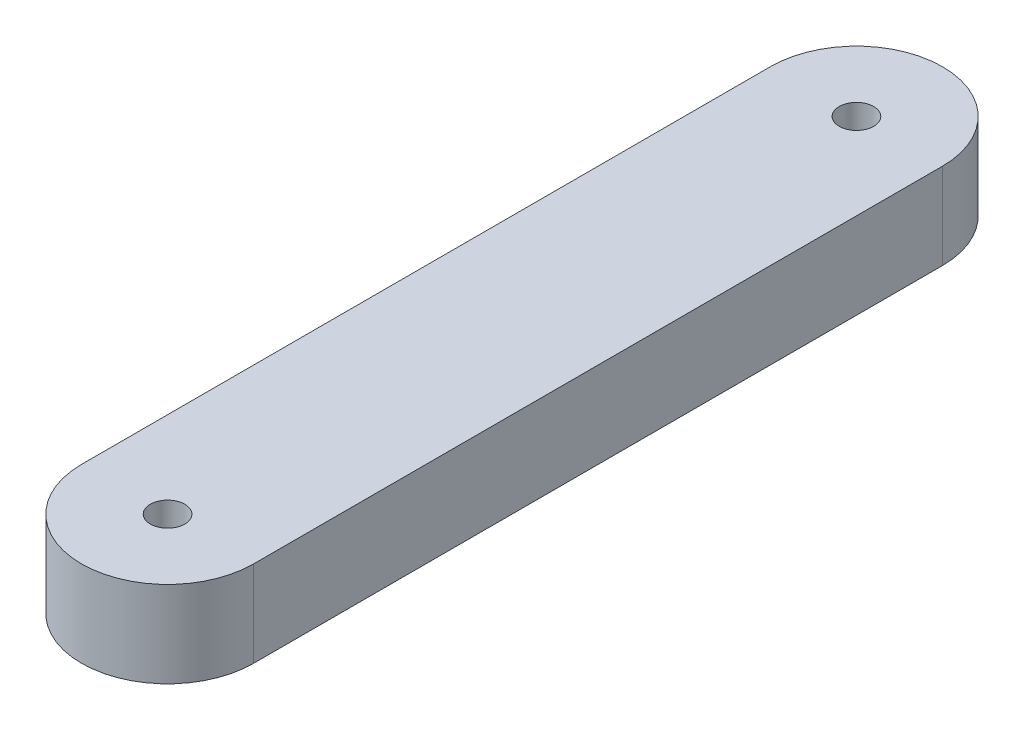
ISO-10303-21;
HEADER;
FILE_DESCRIPTION(('STEP AP214'),'2;1');
FILE_NAME('part.step','',(''),(''),'','','');
FILE_SCHEMA(('AUTOMOTIVE_DESIGN { 1 0 10303 214 1 1 1 1 }'));
ENDSEC;
DATA;
#1=APPLICATION_CONTEXT('core data for automotive mechanical design processes');
#2=APPLICATION_PROTOCOL_DEFINITION('international standard','automotive_design',2000,#1);
#3=PRODUCT_CONTEXT('',#1,'mechanical');
#4=PRODUCT('Part','Part','',(#3));
#5=PRODUCT_RELATED_PRODUCT_CATEGORY('part','',(#4));
#6=PRODUCT_DEFINITION_FORMATION('','',#4);
#7=PRODUCT_DEFINITION_CONTEXT('part definition',#1,'design');
#8=PRODUCT_DEFINITION('design','',#6,#7);
#9=PRODUCT_DEFINITION_SHAPE('','',#8);
#10=(LENGTH_UNIT() NAMED_UNIT(*) SI_UNIT(.MILLI.,.METRE.));
#11=(NAMED_UNIT(*) PLANE_ANGLE_UNIT() SI_UNIT($,.RADIAN.));
#12=(NAMED_UNIT(*) SI_UNIT($,.STERADIAN.) SOLID_ANGLE_UNIT());
#13=UNCERTAINTY_MEASURE_WITH_UNIT(LENGTH_MEASURE(1.E-05),#10,'distance_accuracy_value','');
#14=(GEOMETRIC_REPRESENTATION_CONTEXT(3) GLOBAL_UNCERTAINTY_ASSIGNED_CONTEXT((#13)) GLOBAL_UNIT_ASSIGNED_CONTEXT((#10,
#11,#12)) REPRESENTATION_CONTEXT('',''));
#15=CARTESIAN_POINT('',(0.,0.,0.));
#16=DIRECTION('',(0.,0.,1.));
#17=DIRECTION('',(1.,0.,0.));
#18=AXIS2_PLACEMENT_3D('',#15,#16,#17);
#19=CARTESIAN_POINT('',(0.,5.,-40.));
#20=DIRECTION('',(0.,1.,0.));
#21=DIRECTION('',(0.,0.,1.));
#22=AXIS2_PLACEMENT_3D('',#19,#20,#21);
#23=PLANE('',#22);
#24=CARTESIAN_POINT('',(0.,5.,0.));
#25=DIRECTION('',(0.,1.,0.));
#26=DIRECTION('',(0.,0.,1.));
#27=AXIS2_PLACEMENT_3D('',#24,#25,#26);
#28=CIRCLE('',#27,1.);
#29=CARTESIAN_POINT('',(0.,5.,1.));
#30=VERTEX_POINT('',#29);
#31=EDGE_CURVE('E112',#30,#30,#28,.T.);
#32=ORIENTED_EDGE('',*,*,#31,.F.);
#33=EDGE_LOOP('',(#32));
#34=FACE_BOUND('',#33,.T.);
#35=CARTESIAN_POINT('',(0.,5.,-40.));
#36=DIRECTION('',(0.,1.,0.));
#37=DIRECTION('',(0.,0.,1.));
#38=AXIS2_PLACEMENT_3D('',#35,#36,#37);
#39=CIRCLE('',#38,5.);
#40=CARTESIAN_POINT('',(5.,5.,-40.));
#41=VERTEX_POINT('',#40);
#42=CARTESIAN_POINT('',(-5.,5.,-40.));
#43=VERTEX_POINT('',#42);
#44=EDGE_CURVE('E92',#41,#43,#39,.T.);
#45=ORIENTED_EDGE('',*,*,#44,.T.);
#46=DIRECTION('',(0.,0.,1.));
#47=VECTOR('',#46,1.);
#48=CARTESIAN_POINT('',(-5.,5.,-40.));
#49=LINE('',#48,#47);
#50=CARTESIAN_POINT('',(-5.,5.,0.));
#51=VERTEX_POINT('',#50);
#52=EDGE_CURVE('E87',#43,#51,#49,.T.);
#53=ORIENTED_EDGE('',*,*,#52,.T.);
#54=CARTESIAN_POINT('',(0.,5.,0.));
#55=DIRECTION('',(0.,1.,0.));
#56=DIRECTION('',(0.,0.,1.));
#57=AXIS2_PLACEMENT_3D('',#54,#55,#56);
#58=CIRCLE('',#57,5.);
#59=CARTESIAN_POINT('',(5.,5.,0.));
#60=VERTEX_POINT('',#59);
#61=EDGE_CURVE('E90',#51,#60,#58,.T.);
#62=ORIENTED_EDGE('',*,*,#61,.T.);
#63=DIRECTION('',(0.,0.,-1.));
#64=VECTOR('',#63,1.);
#65=CARTESIAN_POINT('',(5.,5.,-40.));
#66=LINE('',#65,#64);
#67=EDGE_CURVE('E57',#60,#41,#66,.T.);
#68=ORIENTED_EDGE('',*,*,#67,.T.);
#69=EDGE_LOOP('',(#45,#53,#62,#68));
#70=FACE_BOUND('',#69,.T.);
#71=CARTESIAN_POINT('',(0.,5.,-40.));
#72=DIRECTION('',(0.,1.,0.));
#73=DIRECTION('',(0.,0.,1.));
#74=AXIS2_PLACEMENT_3D('',#71,#72,#73);
#75=CIRCLE('',#74,1.);
#76=CARTESIAN_POINT('',(0.,5.,-39.));
#77=VERTEX_POINT('',#76);
#78=EDGE_CURVE('E134',#77,#77,#75,.T.);
#79=ORIENTED_EDGE('',*,*,#78,.F.);
#80=EDGE_LOOP('',(#79));
#81=FACE_BOUND('',#80,.T.);
#82=ADVANCED_FACE('F39',(#34,#70,#81),#23,.T.);
#83=CARTESIAN_POINT('',(0.,0.,-40.));
#84=DIRECTION('',(0.,1.,0.));
#85=DIRECTION('',(0.,0.,1.));
#86=AXIS2_PLACEMENT_3D('',#83,#84,#85);
#87=PLANE('',#86);
#88=CARTESIAN_POINT('',(0.,0.,-40.));
#89=DIRECTION('',(0.,1.,0.));
#90=DIRECTION('',(0.,0.,1.));
#91=AXIS2_PLACEMENT_3D('',#88,#89,#90);
#92=CIRCLE('',#91,5.);
#93=CARTESIAN_POINT('',(5.,0.,-40.));
#94=VERTEX_POINT('',#93);
#95=CARTESIAN_POINT('',(-5.,0.,-40.));
#96=VERTEX_POINT('',#95);
#97=EDGE_CURVE('E108',#94,#96,#92,.T.);
#98=ORIENTED_EDGE('',*,*,#97,.F.);
#99=DIRECTION('',(0.,0.,-1.));
#100=VECTOR('',#99,1.);
#101=CARTESIAN_POINT('',(5.,0.,-40.));
#102=LINE('',#101,#100);
#103=CARTESIAN_POINT('',(5.,0.,0.));
#104=VERTEX_POINT('',#103);
#105=EDGE_CURVE('E80',#104,#94,#102,.T.);
#106=ORIENTED_EDGE('',*,*,#105,.F.);
#107=CARTESIAN_POINT('',(0.,0.,0.));
#108=DIRECTION('',(0.,1.,0.));
#109=DIRECTION('',(0.,0.,1.));
#110=AXIS2_PLACEMENT_3D('',#107,#108,#109);
#111=CIRCLE('',#110,5.);
#112=CARTESIAN_POINT('',(-5.,0.,0.));
#113=VERTEX_POINT('',#112);
#114=EDGE_CURVE('E74',#113,#104,#111,.T.);
#115=ORIENTED_EDGE('',*,*,#114,.F.);
#116=DIRECTION('',(0.,0.,1.));
#117=VECTOR('',#116,1.);
#118=CARTESIAN_POINT('',(-5.,0.,-40.));
#119=LINE('',#118,#117);
#120=EDGE_CURVE('E97',#96,#113,#119,.T.);
#121=ORIENTED_EDGE('',*,*,#120,.F.);
#122=EDGE_LOOP('',(#98,#106,#115,#121));
#123=FACE_BOUND('',#122,.T.);
#124=CARTESIAN_POINT('',(0.,0.,0.));
#125=DIRECTION('',(0.,1.,0.));
#126=DIRECTION('',(0.,0.,1.));
#127=AXIS2_PLACEMENT_3D('',#124,#125,#126);
#128=CIRCLE('',#127,1.);
#129=CARTESIAN_POINT('',(0.,0.,1.));
#130=VERTEX_POINT('',#129);
#131=EDGE_CURVE('E130',#130,#130,#128,.T.);
#132=ORIENTED_EDGE('',*,*,#131,.T.);
#133=EDGE_LOOP('',(#132));
#134=FACE_BOUND('',#133,.T.);
#135=CARTESIAN_POINT('',(0.,0.,-40.));
#136=DIRECTION('',(0.,1.,0.));
#137=DIRECTION('',(0.,0.,1.));
#138=AXIS2_PLACEMENT_3D('',#135,#136,#137);
#139=CIRCLE('',#138,1.);
#140=CARTESIAN_POINT('',(0.,0.,-39.));
#141=VERTEX_POINT('',#140);
#142=EDGE_CURVE('E138',#141,#141,#139,.T.);
#143=ORIENTED_EDGE('',*,*,#142,.T.);
#144=EDGE_LOOP('',(#143));
#145=FACE_BOUND('',#144,.T.);
#146=ADVANCED_FACE('F125',(#123,#134,#145),#87,.F.);
#147=CARTESIAN_POINT('',(0.,5.,-40.));
#148=DIRECTION('',(0.,-1.,0.));
#149=DIRECTION('',(0.,0.,-1.));
#150=AXIS2_PLACEMENT_3D('',#147,#148,#149);
#151=CYLINDRICAL_SURFACE('',#150,5.);
#152=ORIENTED_EDGE('',*,*,#97,.T.);
#153=DIRECTION('',(0.,-1.,0.));
#154=VECTOR('',#153,1.);
#155=CARTESIAN_POINT('',(-5.,5.,-40.));
#156=LINE('',#155,#154);
#157=EDGE_CURVE('E11',#43,#96,#156,.T.);
#158=ORIENTED_EDGE('',*,*,#157,.F.);
#159=ORIENTED_EDGE('',*,*,#44,.F.);
#160=DIRECTION('',(0.,-1.,0.));
#161=VECTOR('',#160,1.);
#162=CARTESIAN_POINT('',(5.,5.,-40.));
#163=LINE('',#162,#161);
#164=EDGE_CURVE('E104',#41,#94,#163,.T.);
#165=ORIENTED_EDGE('',*,*,#164,.T.);
#166=EDGE_LOOP('',(#152,#158,#159,#165));
#167=FACE_BOUND('',#166,.T.);
#168=ADVANCED_FACE('F41',(#167),#151,.T.);
#169=CARTESIAN_POINT('',(-5.,5.,-40.));
#170=DIRECTION('',(1.,0.,0.));
#171=DIRECTION('',(0.,0.,-1.));
#172=AXIS2_PLACEMENT_3D('',#169,#170,#171);
#173=PLANE('',#172);
#174=ORIENTED_EDGE('',*,*,#120,.T.);
#175=DIRECTION('',(0.,-1.,0.));
#176=VECTOR('',#175,1.);
#177=CARTESIAN_POINT('',(-5.,5.,0.));
#178=LINE('',#177,#176);
#179=EDGE_CURVE('E49',#51,#113,#178,.T.);
#180=ORIENTED_EDGE('',*,*,#179,.F.);
#181=ORIENTED_EDGE('',*,*,#52,.F.);
#182=ORIENTED_EDGE('',*,*,#157,.T.);
#183=EDGE_LOOP('',(#174,#180,#181,#182));
#184=FACE_BOUND('',#183,.T.);
#185=ADVANCED_FACE('F96',(#184),#173,.F.);
#186=CARTESIAN_POINT('',(0.,5.,0.));
#187=DIRECTION('',(0.,-1.,0.));
#188=DIRECTION('',(0.,0.,-1.));
#189=AXIS2_PLACEMENT_3D('',#186,#187,#188);
#190=CYLINDRICAL_SURFACE('',#189,5.);
#191=ORIENTED_EDGE('',*,*,#114,.T.);
#192=DIRECTION('',(0.,-1.,0.));
#193=VECTOR('',#192,1.);
#194=CARTESIAN_POINT('',(5.,5.,0.));
#195=LINE('',#194,#193);
#196=EDGE_CURVE('E99',#60,#104,#195,.T.);
#197=ORIENTED_EDGE('',*,*,#196,.F.);
#198=ORIENTED_EDGE('',*,*,#61,.F.);
#199=ORIENTED_EDGE('',*,*,#179,.T.);
#200=EDGE_LOOP('',(#191,#197,#198,#199));
#201=FACE_BOUND('',#200,.T.);
#202=ADVANCED_FACE('F100',(#201),#190,.T.);
#203=CARTESIAN_POINT('',(5.,5.,-40.));
#204=DIRECTION('',(-1.,0.,0.));
#205=DIRECTION('',(0.,0.,1.));
#206=AXIS2_PLACEMENT_3D('',#203,#204,#205);
#207=PLANE('',#206);
#208=ORIENTED_EDGE('',*,*,#105,.T.);
#209=ORIENTED_EDGE('',*,*,#164,.F.);
#210=ORIENTED_EDGE('',*,*,#67,.F.);
#211=ORIENTED_EDGE('',*,*,#196,.T.);
#212=EDGE_LOOP('',(#208,#209,#210,#211));
#213=FACE_BOUND('',#212,.T.);
#214=ADVANCED_FACE('F122',(#213),#207,.F.);
#215=CARTESIAN_POINT('',(0.,5.,0.));
#216=DIRECTION('',(0.,-1.,0.));
#217=DIRECTION('',(0.,0.,-1.));
#218=AXIS2_PLACEMENT_3D('',#215,#216,#217);
#219=CYLINDRICAL_SURFACE('',#218,1.);
#220=ORIENTED_EDGE('',*,*,#31,.T.);
#221=EDGE_LOOP('',(#220));
#222=FACE_BOUND('',#221,.T.);
#223=ORIENTED_EDGE('',*,*,#131,.F.);
#224=EDGE_LOOP('',(#223));
#225=FACE_BOUND('',#224,.T.);
#226=ADVANCED_FACE('F157',(#222,#225),#219,.F.);
#227=CARTESIAN_POINT('',(0.,5.,-40.));
#228=DIRECTION('',(0.,-1.,0.));
#229=DIRECTION('',(0.,0.,-1.));
#230=AXIS2_PLACEMENT_3D('',#227,#228,#229);
#231=CYLINDRICAL_SURFACE('',#230,1.);
#232=ORIENTED_EDGE('',*,*,#78,.T.);
#233=EDGE_LOOP('',(#232));
#234=FACE_BOUND('',#233,.T.);
#235=ORIENTED_EDGE('',*,*,#142,.F.);
#236=EDGE_LOOP('',(#235));
#237=FACE_BOUND('',#236,.T.);
#238=ADVANCED_FACE('F146',(#234,#237),#231,.F.);
#239=CLOSED_SHELL('',(#82,#146,#168,#185,#202,#214,#226,#238));
#240=MANIFOLD_SOLID_BREP('B2',#239);
#241=ADVANCED_BREP_SHAPE_REPRESENTATION('',(#18,#240),#14);
#242=SHAPE_DEFINITION_REPRESENTATION(#9,#241);
ENDSEC;
END-ISO-10303-21;
